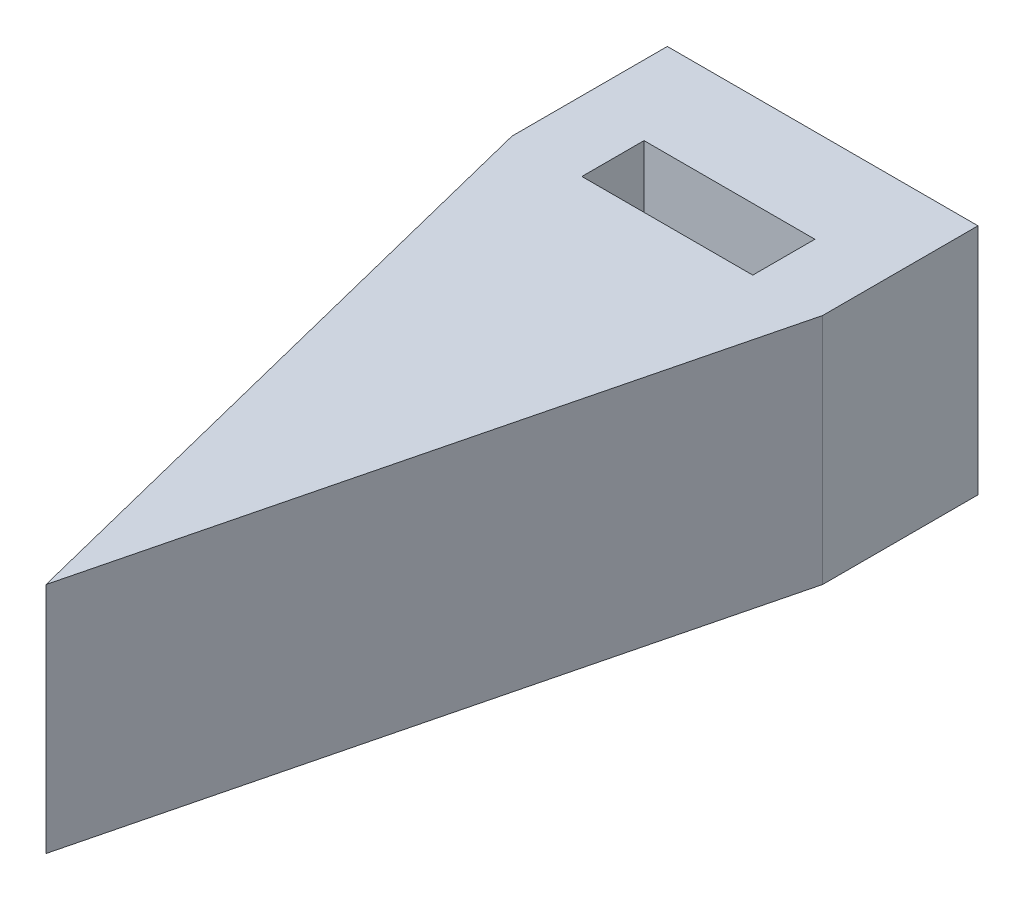
ISO-10303-21;
HEADER;
FILE_DESCRIPTION(('STEP AP214'),'2;1');
FILE_NAME('part.step','',(''),(''),'','','');
FILE_SCHEMA(('AUTOMOTIVE_DESIGN { 1 0 10303 214 1 1 1 1 }'));
ENDSEC;
DATA;
#1=APPLICATION_CONTEXT('core data for automotive mechanical design processes');
#2=APPLICATION_PROTOCOL_DEFINITION('international standard','automotive_design',2000,#1);
#3=PRODUCT_CONTEXT('',#1,'mechanical');
#4=PRODUCT('Part','Part','',(#3));
#5=PRODUCT_RELATED_PRODUCT_CATEGORY('part','',(#4));
#6=PRODUCT_DEFINITION_FORMATION('','',#4);
#7=PRODUCT_DEFINITION_CONTEXT('part definition',#1,'design');
#8=PRODUCT_DEFINITION('design','',#6,#7);
#9=PRODUCT_DEFINITION_SHAPE('','',#8);
#10=(LENGTH_UNIT() NAMED_UNIT(*) SI_UNIT(.MILLI.,.METRE.));
#11=(NAMED_UNIT(*) PLANE_ANGLE_UNIT() SI_UNIT($,.RADIAN.));
#12=(NAMED_UNIT(*) SI_UNIT($,.STERADIAN.) SOLID_ANGLE_UNIT());
#13=UNCERTAINTY_MEASURE_WITH_UNIT(LENGTH_MEASURE(1.E-05),#10,'distance_accuracy_value','');
#14=(GEOMETRIC_REPRESENTATION_CONTEXT(3) GLOBAL_UNCERTAINTY_ASSIGNED_CONTEXT((#13)) GLOBAL_UNIT_ASSIGNED_CONTEXT((#10,
#11,#12)) REPRESENTATION_CONTEXT('',''));
#15=CARTESIAN_POINT('',(0.,0.,0.));
#16=DIRECTION('',(0.,0.,1.));
#17=DIRECTION('',(1.,0.,0.));
#18=AXIS2_PLACEMENT_3D('',#15,#16,#17);
#19=CARTESIAN_POINT('',(0.,3.75,0.));
#20=DIRECTION('',(0.,1.,0.));
#21=DIRECTION('',(0.,0.,1.));
#22=AXIS2_PLACEMENT_3D('',#19,#20,#21);
#23=PLANE('',#22);
#24=DIRECTION('',(0.,0.,1.));
#25=VECTOR('',#24,1.);
#26=CARTESIAN_POINT('',(-5.,3.75,0.));
#27=LINE('',#26,#25);
#28=CARTESIAN_POINT('',(-5.,3.75,0.));
#29=VERTEX_POINT('',#28);
#30=CARTESIAN_POINT('',(-5.,3.75,5.));
#31=VERTEX_POINT('',#30);
#32=EDGE_CURVE('E183',#29,#31,#27,.T.);
#33=ORIENTED_EDGE('',*,*,#32,.T.);
#34=DIRECTION('',(0.242535625036333,0.,0.970142500145332));
#35=VECTOR('',#34,1.);
#36=CARTESIAN_POINT('',(-5.,3.75,5.));
#37=LINE('',#36,#35);
#38=CARTESIAN_POINT('',(0.,3.75,25.));
#39=VERTEX_POINT('',#38);
#40=EDGE_CURVE('E187',#31,#39,#37,.T.);
#41=ORIENTED_EDGE('',*,*,#40,.T.);
#42=DIRECTION('',(0.242535625036333,0.,-0.970142500145332));
#43=VECTOR('',#42,1.);
#44=CARTESIAN_POINT('',(5.,3.75,5.));
#45=LINE('',#44,#43);
#46=CARTESIAN_POINT('',(5.,3.75,5.));
#47=VERTEX_POINT('',#46);
#48=EDGE_CURVE('E191',#39,#47,#45,.T.);
#49=ORIENTED_EDGE('',*,*,#48,.T.);
#50=DIRECTION('',(0.,0.,-1.));
#51=VECTOR('',#50,1.);
#52=CARTESIAN_POINT('',(5.,3.75,0.));
#53=LINE('',#52,#51);
#54=CARTESIAN_POINT('',(5.,3.75,0.));
#55=VERTEX_POINT('',#54);
#56=EDGE_CURVE('E194',#47,#55,#53,.T.);
#57=ORIENTED_EDGE('',*,*,#56,.T.);
#58=DIRECTION('',(-1.,0.,0.));
#59=VECTOR('',#58,1.);
#60=CARTESIAN_POINT('',(-5.,3.75,0.));
#61=LINE('',#60,#59);
#62=EDGE_CURVE('E197',#55,#29,#61,.T.);
#63=ORIENTED_EDGE('',*,*,#62,.T.);
#64=EDGE_LOOP('',(#33,#41,#49,#57,#63));
#65=FACE_BOUND('',#64,.T.);
#66=DIRECTION('',(1.,0.,0.));
#67=VECTOR('',#66,1.);
#68=CARTESIAN_POINT('',(-2.75,3.75,5.));
#69=LINE('',#68,#67);
#70=CARTESIAN_POINT('',(-2.75,3.75,5.));
#71=VERTEX_POINT('',#70);
#72=CARTESIAN_POINT('',(2.75,3.75,5.));
#73=VERTEX_POINT('',#72);
#74=EDGE_CURVE('E143',#71,#73,#69,.T.);
#75=ORIENTED_EDGE('',*,*,#74,.F.);
#76=DIRECTION('',(0.,0.,1.));
#77=VECTOR('',#76,1.);
#78=CARTESIAN_POINT('',(-2.75,3.75,3.));
#79=LINE('',#78,#77);
#80=CARTESIAN_POINT('',(-2.75,3.75,3.));
#81=VERTEX_POINT('',#80);
#82=EDGE_CURVE('E134',#81,#71,#79,.T.);
#83=ORIENTED_EDGE('',*,*,#82,.F.);
#84=DIRECTION('',(-1.,0.,0.));
#85=VECTOR('',#84,1.);
#86=CARTESIAN_POINT('',(-2.75,3.75,3.));
#87=LINE('',#86,#85);
#88=CARTESIAN_POINT('',(2.75,3.75,3.));
#89=VERTEX_POINT('',#88);
#90=EDGE_CURVE('E161',#89,#81,#87,.T.);
#91=ORIENTED_EDGE('',*,*,#90,.F.);
#92=DIRECTION('',(0.,0.,-1.));
#93=VECTOR('',#92,1.);
#94=CARTESIAN_POINT('',(2.75,3.75,3.));
#95=LINE('',#94,#93);
#96=EDGE_CURVE('E156',#73,#89,#95,.T.);
#97=ORIENTED_EDGE('',*,*,#96,.F.);
#98=EDGE_LOOP('',(#75,#83,#91,#97));
#99=FACE_BOUND('',#98,.T.);
#100=ADVANCED_FACE('F47',(#65,#99),#23,.T.);
#101=CARTESIAN_POINT('',(0.,-3.75,0.));
#102=DIRECTION('',(0.,1.,0.));
#103=DIRECTION('',(0.,0.,1.));
#104=AXIS2_PLACEMENT_3D('',#101,#102,#103);
#105=PLANE('',#104);
#106=DIRECTION('',(0.,0.,1.));
#107=VECTOR('',#106,1.);
#108=CARTESIAN_POINT('',(-5.,-3.75,0.));
#109=LINE('',#108,#107);
#110=CARTESIAN_POINT('',(-5.,-3.75,0.));
#111=VERTEX_POINT('',#110);
#112=CARTESIAN_POINT('',(-5.,-3.75,5.));
#113=VERTEX_POINT('',#112);
#114=EDGE_CURVE('E152',#111,#113,#109,.T.);
#115=ORIENTED_EDGE('',*,*,#114,.F.);
#116=DIRECTION('',(-1.,0.,0.));
#117=VECTOR('',#116,1.);
#118=CARTESIAN_POINT('',(-5.,-3.75,0.));
#119=LINE('',#118,#117);
#120=CARTESIAN_POINT('',(5.,-3.75,0.));
#121=VERTEX_POINT('',#120);
#122=EDGE_CURVE('E188',#121,#111,#119,.T.);
#123=ORIENTED_EDGE('',*,*,#122,.F.);
#124=DIRECTION('',(0.,0.,-1.));
#125=VECTOR('',#124,1.);
#126=CARTESIAN_POINT('',(5.,-3.75,0.));
#127=LINE('',#126,#125);
#128=CARTESIAN_POINT('',(5.,-3.75,5.));
#129=VERTEX_POINT('',#128);
#130=EDGE_CURVE('E209',#129,#121,#127,.T.);
#131=ORIENTED_EDGE('',*,*,#130,.F.);
#132=DIRECTION('',(0.242535625036333,0.,-0.970142500145332));
#133=VECTOR('',#132,1.);
#134=CARTESIAN_POINT('',(5.,-3.75,5.));
#135=LINE('',#134,#133);
#136=CARTESIAN_POINT('',(0.,-3.75,25.));
#137=VERTEX_POINT('',#136);
#138=EDGE_CURVE('E206',#137,#129,#135,.T.);
#139=ORIENTED_EDGE('',*,*,#138,.F.);
#140=DIRECTION('',(0.242535625036333,0.,0.970142500145332));
#141=VECTOR('',#140,1.);
#142=CARTESIAN_POINT('',(-5.,-3.75,5.));
#143=LINE('',#142,#141);
#144=EDGE_CURVE('E203',#113,#137,#143,.T.);
#145=ORIENTED_EDGE('',*,*,#144,.F.);
#146=EDGE_LOOP('',(#115,#123,#131,#139,#145));
#147=FACE_BOUND('',#146,.T.);
#148=DIRECTION('',(0.,0.,1.));
#149=VECTOR('',#148,1.);
#150=CARTESIAN_POINT('',(-2.75,-3.75,3.));
#151=LINE('',#150,#149);
#152=CARTESIAN_POINT('',(-2.75,-3.75,3.));
#153=VERTEX_POINT('',#152);
#154=CARTESIAN_POINT('',(-2.75,-3.75,5.));
#155=VERTEX_POINT('',#154);
#156=EDGE_CURVE('E77',#153,#155,#151,.T.);
#157=ORIENTED_EDGE('',*,*,#156,.T.);
#158=DIRECTION('',(1.,0.,0.));
#159=VECTOR('',#158,1.);
#160=CARTESIAN_POINT('',(-2.75,-3.75,5.));
#161=LINE('',#160,#159);
#162=CARTESIAN_POINT('',(2.75,-3.75,5.));
#163=VERTEX_POINT('',#162);
#164=EDGE_CURVE('E150',#155,#163,#161,.T.);
#165=ORIENTED_EDGE('',*,*,#164,.T.);
#166=DIRECTION('',(0.,0.,-1.));
#167=VECTOR('',#166,1.);
#168=CARTESIAN_POINT('',(2.75,-3.75,3.));
#169=LINE('',#168,#167);
#170=CARTESIAN_POINT('',(2.75,-3.75,3.));
#171=VERTEX_POINT('',#170);
#172=EDGE_CURVE('E170',#163,#171,#169,.T.);
#173=ORIENTED_EDGE('',*,*,#172,.T.);
#174=DIRECTION('',(-1.,0.,0.));
#175=VECTOR('',#174,1.);
#176=CARTESIAN_POINT('',(-2.75,-3.75,3.));
#177=LINE('',#176,#175);
#178=EDGE_CURVE('E144',#171,#153,#177,.T.);
#179=ORIENTED_EDGE('',*,*,#178,.T.);
#180=EDGE_LOOP('',(#157,#165,#173,#179));
#181=FACE_BOUND('',#180,.T.);
#182=ADVANCED_FACE('F235',(#147,#181),#105,.F.);
#183=CARTESIAN_POINT('',(-5.,3.75,0.));
#184=DIRECTION('',(1.,0.,0.));
#185=DIRECTION('',(0.,0.,-1.));
#186=AXIS2_PLACEMENT_3D('',#183,#184,#185);
#187=PLANE('',#186);
#188=ORIENTED_EDGE('',*,*,#114,.T.);
#189=DIRECTION('',(0.,-1.,0.));
#190=VECTOR('',#189,1.);
#191=CARTESIAN_POINT('',(-5.,3.75,5.));
#192=LINE('',#191,#190);
#193=EDGE_CURVE('E11',#31,#113,#192,.T.);
#194=ORIENTED_EDGE('',*,*,#193,.F.);
#195=ORIENTED_EDGE('',*,*,#32,.F.);
#196=DIRECTION('',(0.,-1.,0.));
#197=VECTOR('',#196,1.);
#198=CARTESIAN_POINT('',(-5.,3.75,0.));
#199=LINE('',#198,#197);
#200=EDGE_CURVE('E200',#29,#111,#199,.T.);
#201=ORIENTED_EDGE('',*,*,#200,.T.);
#202=EDGE_LOOP('',(#188,#194,#195,#201));
#203=FACE_BOUND('',#202,.T.);
#204=ADVANCED_FACE('F49',(#203),#187,.F.);
#205=CARTESIAN_POINT('',(-5.,3.75,5.));
#206=DIRECTION('',(0.970142500145332,0.,-0.242535625036333));
#207=DIRECTION('',(-0.242535625036333,0.,-0.970142500145332));
#208=AXIS2_PLACEMENT_3D('',#205,#206,#207);
#209=PLANE('',#208);
#210=ORIENTED_EDGE('',*,*,#144,.T.);
#211=DIRECTION('',(0.,-1.,0.));
#212=VECTOR('',#211,1.);
#213=CARTESIAN_POINT('',(0.,3.75,25.));
#214=LINE('',#213,#212);
#215=EDGE_CURVE('E56',#39,#137,#214,.T.);
#216=ORIENTED_EDGE('',*,*,#215,.F.);
#217=ORIENTED_EDGE('',*,*,#40,.F.);
#218=ORIENTED_EDGE('',*,*,#193,.T.);
#219=EDGE_LOOP('',(#210,#216,#217,#218));
#220=FACE_BOUND('',#219,.T.);
#221=ADVANCED_FACE('F249',(#220),#209,.F.);
#222=CARTESIAN_POINT('',(5.,3.75,5.));
#223=DIRECTION('',(-0.970142500145332,0.,-0.242535625036333));
#224=DIRECTION('',(-0.242535625036333,0.,0.970142500145332));
#225=AXIS2_PLACEMENT_3D('',#222,#223,#224);
#226=PLANE('',#225);
#227=ORIENTED_EDGE('',*,*,#138,.T.);
#228=DIRECTION('',(0.,-1.,0.));
#229=VECTOR('',#228,1.);
#230=CARTESIAN_POINT('',(5.,3.75,5.));
#231=LINE('',#230,#229);
#232=EDGE_CURVE('E221',#47,#129,#231,.T.);
#233=ORIENTED_EDGE('',*,*,#232,.F.);
#234=ORIENTED_EDGE('',*,*,#48,.F.);
#235=ORIENTED_EDGE('',*,*,#215,.T.);
#236=EDGE_LOOP('',(#227,#233,#234,#235));
#237=FACE_BOUND('',#236,.T.);
#238=ADVANCED_FACE('F229',(#237),#226,.F.);
#239=CARTESIAN_POINT('',(5.,3.75,0.));
#240=DIRECTION('',(-1.,0.,0.));
#241=DIRECTION('',(0.,0.,1.));
#242=AXIS2_PLACEMENT_3D('',#239,#240,#241);
#243=PLANE('',#242);
#244=ORIENTED_EDGE('',*,*,#130,.T.);
#245=DIRECTION('',(0.,-1.,0.));
#246=VECTOR('',#245,1.);
#247=CARTESIAN_POINT('',(5.,3.75,0.));
#248=LINE('',#247,#246);
#249=EDGE_CURVE('E217',#55,#121,#248,.T.);
#250=ORIENTED_EDGE('',*,*,#249,.F.);
#251=ORIENTED_EDGE('',*,*,#56,.F.);
#252=ORIENTED_EDGE('',*,*,#232,.T.);
#253=EDGE_LOOP('',(#244,#250,#251,#252));
#254=FACE_BOUND('',#253,.T.);
#255=ADVANCED_FACE('F240',(#254),#243,.F.);
#256=CARTESIAN_POINT('',(-5.,3.75,0.));
#257=DIRECTION('',(0.,0.,1.));
#258=DIRECTION('',(1.,0.,0.));
#259=AXIS2_PLACEMENT_3D('',#256,#257,#258);
#260=PLANE('',#259);
#261=ORIENTED_EDGE('',*,*,#122,.T.);
#262=ORIENTED_EDGE('',*,*,#200,.F.);
#263=ORIENTED_EDGE('',*,*,#62,.F.);
#264=ORIENTED_EDGE('',*,*,#249,.T.);
#265=EDGE_LOOP('',(#261,#262,#263,#264));
#266=FACE_BOUND('',#265,.T.);
#267=ADVANCED_FACE('F244',(#266),#260,.F.);
#268=CARTESIAN_POINT('',(-2.75,3.75,3.));
#269=DIRECTION('',(1.,0.,0.));
#270=DIRECTION('',(0.,0.,-1.));
#271=AXIS2_PLACEMENT_3D('',#268,#269,#270);
#272=PLANE('',#271);
#273=ORIENTED_EDGE('',*,*,#156,.F.);
#274=DIRECTION('',(0.,-1.,0.));
#275=VECTOR('',#274,1.);
#276=CARTESIAN_POINT('',(-2.75,3.75,3.));
#277=LINE('',#276,#275);
#278=EDGE_CURVE('E138',#81,#153,#277,.T.);
#279=ORIENTED_EDGE('',*,*,#278,.F.);
#280=ORIENTED_EDGE('',*,*,#82,.T.);
#281=DIRECTION('',(0.,-1.,0.));
#282=VECTOR('',#281,1.);
#283=CARTESIAN_POINT('',(-2.75,3.75,5.));
#284=LINE('',#283,#282);
#285=EDGE_CURVE('E137',#71,#155,#284,.T.);
#286=ORIENTED_EDGE('',*,*,#285,.T.);
#287=EDGE_LOOP('',(#273,#279,#280,#286));
#288=FACE_BOUND('',#287,.T.);
#289=ADVANCED_FACE('F136',(#288),#272,.T.);
#290=CARTESIAN_POINT('',(-2.75,3.75,5.));
#291=DIRECTION('',(0.,0.,-1.));
#292=DIRECTION('',(-1.,0.,0.));
#293=AXIS2_PLACEMENT_3D('',#290,#291,#292);
#294=PLANE('',#293);
#295=ORIENTED_EDGE('',*,*,#164,.F.);
#296=ORIENTED_EDGE('',*,*,#285,.F.);
#297=ORIENTED_EDGE('',*,*,#74,.T.);
#298=DIRECTION('',(0.,-1.,0.));
#299=VECTOR('',#298,1.);
#300=CARTESIAN_POINT('',(2.75,3.75,5.));
#301=LINE('',#300,#299);
#302=EDGE_CURVE('E153',#73,#163,#301,.T.);
#303=ORIENTED_EDGE('',*,*,#302,.T.);
#304=EDGE_LOOP('',(#295,#296,#297,#303));
#305=FACE_BOUND('',#304,.T.);
#306=ADVANCED_FACE('F147',(#305),#294,.T.);
#307=CARTESIAN_POINT('',(2.75,3.75,3.));
#308=DIRECTION('',(-1.,0.,0.));
#309=DIRECTION('',(0.,0.,1.));
#310=AXIS2_PLACEMENT_3D('',#307,#308,#309);
#311=PLANE('',#310);
#312=ORIENTED_EDGE('',*,*,#172,.F.);
#313=ORIENTED_EDGE('',*,*,#302,.F.);
#314=ORIENTED_EDGE('',*,*,#96,.T.);
#315=DIRECTION('',(0.,-1.,0.));
#316=VECTOR('',#315,1.);
#317=CARTESIAN_POINT('',(2.75,3.75,3.));
#318=LINE('',#317,#316);
#319=EDGE_CURVE('E66',#89,#171,#318,.T.);
#320=ORIENTED_EDGE('',*,*,#319,.T.);
#321=EDGE_LOOP('',(#312,#313,#314,#320));
#322=FACE_BOUND('',#321,.T.);
#323=ADVANCED_FACE('F299',(#322),#311,.T.);
#324=CARTESIAN_POINT('',(-2.75,3.75,3.));
#325=DIRECTION('',(0.,0.,1.));
#326=DIRECTION('',(1.,0.,0.));
#327=AXIS2_PLACEMENT_3D('',#324,#325,#326);
#328=PLANE('',#327);
#329=ORIENTED_EDGE('',*,*,#178,.F.);
#330=ORIENTED_EDGE('',*,*,#319,.F.);
#331=ORIENTED_EDGE('',*,*,#90,.T.);
#332=ORIENTED_EDGE('',*,*,#278,.T.);
#333=EDGE_LOOP('',(#329,#330,#331,#332));
#334=FACE_BOUND('',#333,.T.);
#335=ADVANCED_FACE('F306',(#334),#328,.T.);
#336=CLOSED_SHELL('',(#100,#182,#204,#221,#238,#255,#267,#289,#306,#323,#335));
#337=MANIFOLD_SOLID_BREP('B2',#336);
#338=ADVANCED_BREP_SHAPE_REPRESENTATION('',(#18,#337),#14);
#339=SHAPE_DEFINITION_REPRESENTATION(#9,#338);
ENDSEC;
END-ISO-10303-21;
